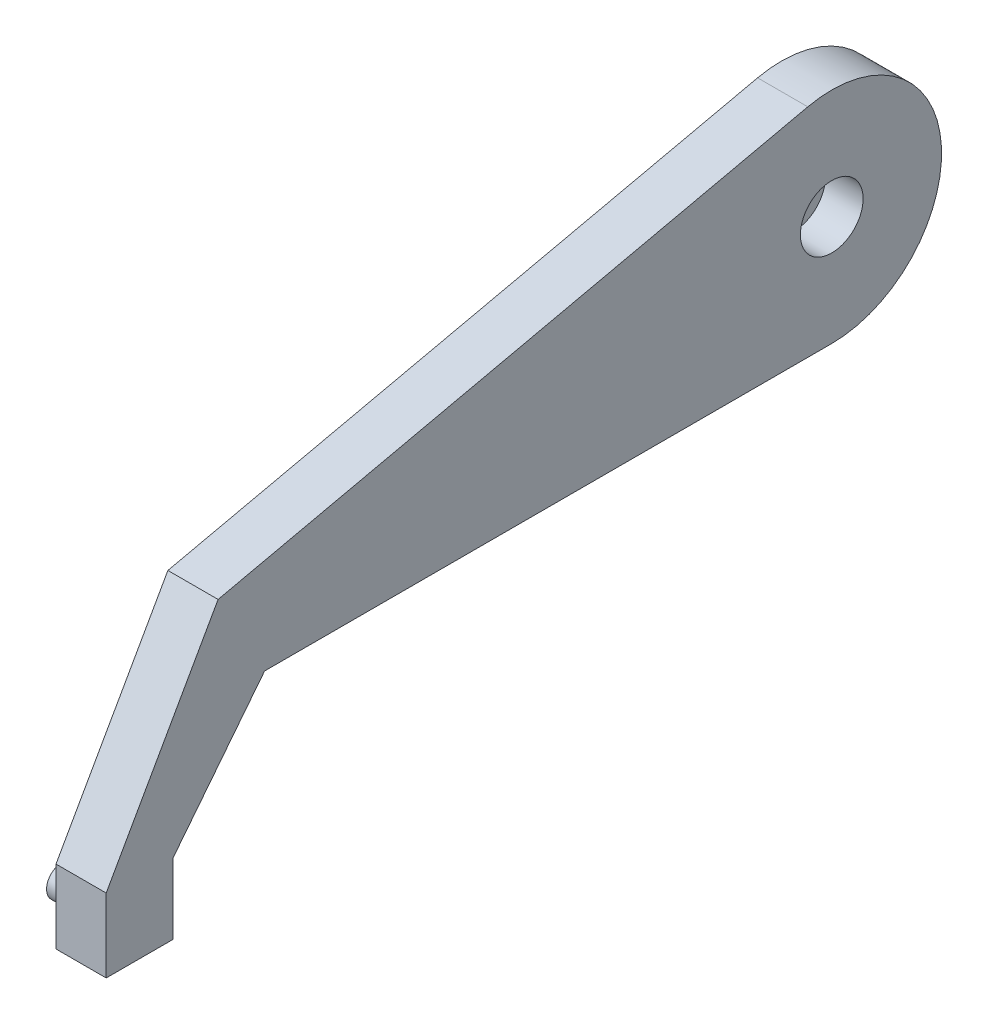
ISO-10303-21;
HEADER;
FILE_DESCRIPTION(('STEP AP214'),'2;1');
FILE_NAME('part.step','',(''),(''),'','','');
FILE_SCHEMA(('AUTOMOTIVE_DESIGN { 1 0 10303 214 1 1 1 1 }'));
ENDSEC;
DATA;
#1=APPLICATION_CONTEXT('core data for automotive mechanical design processes');
#2=APPLICATION_PROTOCOL_DEFINITION('international standard','automotive_design',2000,#1);
#3=PRODUCT_CONTEXT('',#1,'mechanical');
#4=PRODUCT('Part','Part','',(#3));
#5=PRODUCT_RELATED_PRODUCT_CATEGORY('part','',(#4));
#6=PRODUCT_DEFINITION_FORMATION('','',#4);
#7=PRODUCT_DEFINITION_CONTEXT('part definition',#1,'design');
#8=PRODUCT_DEFINITION('design','',#6,#7);
#9=PRODUCT_DEFINITION_SHAPE('','',#8);
#10=(LENGTH_UNIT() NAMED_UNIT(*) SI_UNIT(.MILLI.,.METRE.));
#11=(NAMED_UNIT(*) PLANE_ANGLE_UNIT() SI_UNIT($,.RADIAN.));
#12=(NAMED_UNIT(*) SI_UNIT($,.STERADIAN.) SOLID_ANGLE_UNIT());
#13=UNCERTAINTY_MEASURE_WITH_UNIT(LENGTH_MEASURE(1.E-05),#10,'distance_accuracy_value','');
#14=(GEOMETRIC_REPRESENTATION_CONTEXT(3) GLOBAL_UNCERTAINTY_ASSIGNED_CONTEXT((#13)) GLOBAL_UNIT_ASSIGNED_CONTEXT((#10,
#11,#12)) REPRESENTATION_CONTEXT('',''));
#15=CARTESIAN_POINT('',(0.,0.,0.));
#16=DIRECTION('',(0.,0.,1.));
#17=DIRECTION('',(1.,0.,0.));
#18=AXIS2_PLACEMENT_3D('',#15,#16,#17);
#19=CARTESIAN_POINT('',(80.,294.084726626196,1208.9161975073));
#20=DIRECTION('',(-1.,0.,0.));
#21=DIRECTION('',(0.,0.,1.));
#22=AXIS2_PLACEMENT_3D('',#19,#20,#21);
#23=CYLINDRICAL_SURFACE('',#22,175.);
#24=CARTESIAN_POINT('',(0.,294.084726626196,1208.9161975073));
#25=DIRECTION('',(1.,0.,0.));
#26=DIRECTION('',(0.,0.,1.));
#27=AXIS2_PLACEMENT_3D('',#24,#25,#26);
#28=CIRCLE('',#27,175.);
#29=CARTESIAN_POINT('',(0.,119.084726626196,1208.9161975073));
#30=VERTEX_POINT('',#29);
#31=CARTESIAN_POINT('',(0.,464.873782041208,1247.07505690388));
#32=VERTEX_POINT('',#31);
#33=EDGE_CURVE('E146',#30,#32,#28,.T.);
#34=ORIENTED_EDGE('',*,*,#33,.T.);
#35=DIRECTION('',(-1.,0.,0.));
#36=VECTOR('',#35,1.);
#37=CARTESIAN_POINT('',(80.,464.873782041208,1247.07505690388));
#38=LINE('',#37,#36);
#39=CARTESIAN_POINT('',(80.,464.873782041208,1247.07505690388));
#40=VERTEX_POINT('',#39);
#41=EDGE_CURVE('E11',#40,#32,#38,.T.);
#42=ORIENTED_EDGE('',*,*,#41,.F.);
#43=CARTESIAN_POINT('',(80.,294.084726626196,1208.9161975073));
#44=DIRECTION('',(1.,0.,0.));
#45=DIRECTION('',(0.,0.,1.));
#46=AXIS2_PLACEMENT_3D('',#43,#44,#45);
#47=CIRCLE('',#46,175.);
#48=CARTESIAN_POINT('',(80.,119.084726626196,1208.9161975073));
#49=VERTEX_POINT('',#48);
#50=EDGE_CURVE('E169',#49,#40,#47,.T.);
#51=ORIENTED_EDGE('',*,*,#50,.F.);
#52=DIRECTION('',(-1.,0.,0.));
#53=VECTOR('',#52,1.);
#54=CARTESIAN_POINT('',(80.,119.084726626196,1208.9161975073));
#55=LINE('',#54,#53);
#56=EDGE_CURVE('E142',#49,#30,#55,.T.);
#57=ORIENTED_EDGE('',*,*,#56,.T.);
#58=EDGE_LOOP('',(#34,#42,#51,#57));
#59=FACE_BOUND('',#58,.T.);
#60=ADVANCED_FACE('F45',(#59),#23,.T.);
#61=CARTESIAN_POINT('',(80.,464.873782041208,1247.07505690388));
#62=DIRECTION('',(0.,-0.975937459514354,-0.218050625123315));
#63=DIRECTION('',(0.,0.218050625123315,-0.975937459514354));
#64=AXIS2_PLACEMENT_3D('',#61,#62,#63);
#65=PLANE('',#64);
#66=DIRECTION('',(0.,-0.218050625123315,0.975937459514354));
#67=VECTOR('',#66,1.);
#68=CARTESIAN_POINT('',(0.,464.873782041208,1247.07505690388));
#69=LINE('',#68,#67);
#70=CARTESIAN_POINT('',(0.,254.913114054583,2186.80398818725));
#71=VERTEX_POINT('',#70);
#72=EDGE_CURVE('E150',#32,#71,#69,.T.);
#73=ORIENTED_EDGE('',*,*,#72,.T.);
#74=DIRECTION('',(-1.,0.,0.));
#75=VECTOR('',#74,1.);
#76=CARTESIAN_POINT('',(80.,254.913114054583,2186.80398818725));
#77=LINE('',#76,#75);
#78=CARTESIAN_POINT('',(80.,254.913114054583,2186.80398818725));
#79=VERTEX_POINT('',#78);
#80=EDGE_CURVE('E54',#79,#71,#77,.T.);
#81=ORIENTED_EDGE('',*,*,#80,.F.);
#82=DIRECTION('',(0.,-0.218050625123315,0.975937459514354));
#83=VECTOR('',#82,1.);
#84=CARTESIAN_POINT('',(80.,464.873782041208,1247.07505690388));
#85=LINE('',#84,#83);
#86=EDGE_CURVE('E105',#40,#79,#85,.T.);
#87=ORIENTED_EDGE('',*,*,#86,.F.);
#88=ORIENTED_EDGE('',*,*,#41,.T.);
#89=EDGE_LOOP('',(#73,#81,#87,#88));
#90=FACE_BOUND('',#89,.T.);
#91=ADVANCED_FACE('F253',(#90),#65,.F.);
#92=CARTESIAN_POINT('',(80.,254.913114054583,2186.80398818725));
#93=DIRECTION('',(0.,-0.491359726652531,-0.870956726263682));
#94=DIRECTION('',(0.,0.870956726263682,-0.491359726652531));
#95=AXIS2_PLACEMENT_3D('',#92,#93,#94);
#96=PLANE('',#95);
#97=DIRECTION('',(0.,-0.870956726263682,0.491359726652531));
#98=VECTOR('',#97,1.);
#99=CARTESIAN_POINT('',(0.,254.913114054583,2186.80398818725));
#100=LINE('',#99,#98);
#101=CARTESIAN_POINT('',(0.,-61.1262620595169,2365.10104563698));
#102=VERTEX_POINT('',#101);
#103=EDGE_CURVE('E154',#71,#102,#100,.T.);
#104=ORIENTED_EDGE('',*,*,#103,.T.);
#105=DIRECTION('',(-1.,0.,0.));
#106=VECTOR('',#105,1.);
#107=CARTESIAN_POINT('',(80.,-61.1262620595169,2365.10104563698));
#108=LINE('',#107,#106);
#109=CARTESIAN_POINT('',(80.,-61.1262620595169,2365.10104563698));
#110=VERTEX_POINT('',#109);
#111=EDGE_CURVE('E180',#110,#102,#108,.T.);
#112=ORIENTED_EDGE('',*,*,#111,.F.);
#113=DIRECTION('',(0.,-0.870956726263682,0.491359726652531));
#114=VECTOR('',#113,1.);
#115=CARTESIAN_POINT('',(80.,254.913114054583,2186.80398818725));
#116=LINE('',#115,#114);
#117=EDGE_CURVE('E190',#79,#110,#116,.T.);
#118=ORIENTED_EDGE('',*,*,#117,.F.);
#119=ORIENTED_EDGE('',*,*,#80,.T.);
#120=EDGE_LOOP('',(#104,#112,#118,#119));
#121=FACE_BOUND('',#120,.T.);
#122=ADVANCED_FACE('F188',(#121),#96,.F.);
#123=CARTESIAN_POINT('',(80.,-61.1262620595169,2365.10104563698));
#124=DIRECTION('',(0.,0.,-1.));
#125=DIRECTION('',(-1.,0.,0.));
#126=AXIS2_PLACEMENT_3D('',#123,#124,#125);
#127=PLANE('',#126);
#128=DIRECTION('',(0.,-1.,0.));
#129=VECTOR('',#128,1.);
#130=CARTESIAN_POINT('',(0.,-61.1262620595169,2365.10104563698));
#131=LINE('',#130,#129);
#132=CARTESIAN_POINT('',(0.,-178.375628010269,2365.10104563698));
#133=VERTEX_POINT('',#132);
#134=EDGE_CURVE('E157',#102,#133,#131,.T.);
#135=ORIENTED_EDGE('',*,*,#134,.T.);
#136=DIRECTION('',(-1.,0.,0.));
#137=VECTOR('',#136,1.);
#138=CARTESIAN_POINT('',(80.,-178.375628010269,2365.10104563698));
#139=LINE('',#138,#137);
#140=CARTESIAN_POINT('',(80.,-178.375628010269,2365.10104563698));
#141=VERTEX_POINT('',#140);
#142=EDGE_CURVE('E176',#141,#133,#139,.T.);
#143=ORIENTED_EDGE('',*,*,#142,.F.);
#144=DIRECTION('',(0.,-1.,0.));
#145=VECTOR('',#144,1.);
#146=CARTESIAN_POINT('',(80.,-61.1262620595169,2365.10104563698));
#147=LINE('',#146,#145);
#148=EDGE_CURVE('E203',#110,#141,#147,.T.);
#149=ORIENTED_EDGE('',*,*,#148,.F.);
#150=ORIENTED_EDGE('',*,*,#111,.T.);
#151=EDGE_LOOP('',(#135,#143,#149,#150));
#152=FACE_BOUND('',#151,.T.);
#153=ADVANCED_FACE('F198',(#152),#127,.F.);
#154=CARTESIAN_POINT('',(80.,-178.375628010269,2365.10104563698));
#155=DIRECTION('',(0.,1.,0.));
#156=DIRECTION('',(0.,0.,1.));
#157=AXIS2_PLACEMENT_3D('',#154,#155,#156);
#158=PLANE('',#157);
#159=DIRECTION('',(0.,0.,-1.));
#160=VECTOR('',#159,1.);
#161=CARTESIAN_POINT('',(0.,-178.375628010269,2365.10104563698));
#162=LINE('',#161,#160);
#163=CARTESIAN_POINT('',(0.,-178.375628010269,2258.83533082478));
#164=VERTEX_POINT('',#163);
#165=EDGE_CURVE('E160',#133,#164,#162,.T.);
#166=ORIENTED_EDGE('',*,*,#165,.T.);
#167=DIRECTION('',(-1.,0.,0.));
#168=VECTOR('',#167,1.);
#169=CARTESIAN_POINT('',(80.,-178.375628010269,2258.83533082478));
#170=LINE('',#169,#168);
#171=CARTESIAN_POINT('',(80.,-178.375628010269,2258.83533082478));
#172=VERTEX_POINT('',#171);
#173=EDGE_CURVE('E135',#172,#164,#170,.T.);
#174=ORIENTED_EDGE('',*,*,#173,.F.);
#175=DIRECTION('',(0.,0.,-1.));
#176=VECTOR('',#175,1.);
#177=CARTESIAN_POINT('',(80.,-178.375628010269,2365.10104563698));
#178=LINE('',#177,#176);
#179=EDGE_CURVE('E124',#141,#172,#178,.T.);
#180=ORIENTED_EDGE('',*,*,#179,.F.);
#181=ORIENTED_EDGE('',*,*,#142,.T.);
#182=EDGE_LOOP('',(#166,#174,#180,#181));
#183=FACE_BOUND('',#182,.T.);
#184=ADVANCED_FACE('F201',(#183),#158,.F.);
#185=CARTESIAN_POINT('',(80.,-178.375628010269,2258.83533082478));
#186=DIRECTION('',(0.,0.,1.));
#187=DIRECTION('',(1.,0.,0.));
#188=AXIS2_PLACEMENT_3D('',#185,#186,#187);
#189=PLANE('',#188);
#190=DIRECTION('',(0.,1.,0.));
#191=VECTOR('',#190,1.);
#192=CARTESIAN_POINT('',(0.,-178.375628010269,2258.83533082478));
#193=LINE('',#192,#191);
#194=CARTESIAN_POINT('',(0.,-66.2761832366053,2258.83533082478));
#195=VERTEX_POINT('',#194);
#196=EDGE_CURVE('E133',#164,#195,#193,.T.);
#197=ORIENTED_EDGE('',*,*,#196,.T.);
#198=DIRECTION('',(-1.,0.,0.));
#199=VECTOR('',#198,1.);
#200=CARTESIAN_POINT('',(80.,-66.2761832366053,2258.83533082478));
#201=LINE('',#200,#199);
#202=CARTESIAN_POINT('',(80.,-66.2761832366053,2258.83533082478));
#203=VERTEX_POINT('',#202);
#204=EDGE_CURVE('E130',#203,#195,#201,.T.);
#205=ORIENTED_EDGE('',*,*,#204,.F.);
#206=DIRECTION('',(0.,1.,0.));
#207=VECTOR('',#206,1.);
#208=CARTESIAN_POINT('',(80.,-178.375628010269,2258.83533082478));
#209=LINE('',#208,#207);
#210=EDGE_CURVE('E118',#172,#203,#209,.T.);
#211=ORIENTED_EDGE('',*,*,#210,.F.);
#212=ORIENTED_EDGE('',*,*,#173,.T.);
#213=EDGE_LOOP('',(#197,#205,#211,#212));
#214=FACE_BOUND('',#213,.T.);
#215=ADVANCED_FACE('F131',(#214),#189,.F.);
#216=CARTESIAN_POINT('',(80.,-66.2761832366053,2258.83533082478));
#217=DIRECTION('',(0.,0.619086939164466,0.785322457183018));
#218=DIRECTION('',(0.,-0.785322457183018,0.619086939164466));
#219=AXIS2_PLACEMENT_3D('',#216,#217,#218);
#220=PLANE('',#219);
#221=DIRECTION('',(0.,0.785322457183018,-0.619086939164466));
#222=VECTOR('',#221,1.);
#223=CARTESIAN_POINT('',(0.,-66.2761832366053,2258.83533082478));
#224=LINE('',#223,#222);
#225=CARTESIAN_POINT('',(0.,119.084726626196,2112.71125493966));
#226=VERTEX_POINT('',#225);
#227=EDGE_CURVE('E91',#195,#226,#224,.T.);
#228=ORIENTED_EDGE('',*,*,#227,.T.);
#229=DIRECTION('',(-1.,0.,0.));
#230=VECTOR('',#229,1.);
#231=CARTESIAN_POINT('',(80.,119.084726626196,2112.71125493966));
#232=LINE('',#231,#230);
#233=CARTESIAN_POINT('',(80.,119.084726626196,2112.71125493966));
#234=VERTEX_POINT('',#233);
#235=EDGE_CURVE('E136',#234,#226,#232,.T.);
#236=ORIENTED_EDGE('',*,*,#235,.F.);
#237=DIRECTION('',(0.,0.785322457183018,-0.619086939164466));
#238=VECTOR('',#237,1.);
#239=CARTESIAN_POINT('',(80.,-66.2761832366053,2258.83533082478));
#240=LINE('',#239,#238);
#241=EDGE_CURVE('E122',#203,#234,#240,.T.);
#242=ORIENTED_EDGE('',*,*,#241,.F.);
#243=ORIENTED_EDGE('',*,*,#204,.T.);
#244=EDGE_LOOP('',(#228,#236,#242,#243));
#245=FACE_BOUND('',#244,.T.);
#246=ADVANCED_FACE('F138',(#245),#220,.F.);
#247=CARTESIAN_POINT('',(80.,119.084726626196,2112.71125493966));
#248=DIRECTION('',(0.,1.,0.));
#249=DIRECTION('',(0.,0.,1.));
#250=AXIS2_PLACEMENT_3D('',#247,#248,#249);
#251=PLANE('',#250);
#252=DIRECTION('',(0.,0.,-1.));
#253=VECTOR('',#252,1.);
#254=CARTESIAN_POINT('',(0.,119.084726626196,2112.71125493966));
#255=LINE('',#254,#253);
#256=EDGE_CURVE('E97',#226,#30,#255,.T.);
#257=ORIENTED_EDGE('',*,*,#256,.T.);
#258=ORIENTED_EDGE('',*,*,#56,.F.);
#259=DIRECTION('',(0.,0.,-1.));
#260=VECTOR('',#259,1.);
#261=CARTESIAN_POINT('',(80.,119.084726626196,2112.71125493966));
#262=LINE('',#261,#260);
#263=EDGE_CURVE('E62',#234,#49,#262,.T.);
#264=ORIENTED_EDGE('',*,*,#263,.F.);
#265=ORIENTED_EDGE('',*,*,#235,.T.);
#266=EDGE_LOOP('',(#257,#258,#264,#265));
#267=FACE_BOUND('',#266,.T.);
#268=ADVANCED_FACE('F248',(#267),#251,.F.);
#269=CARTESIAN_POINT('',(80.,294.084726626196,1208.9161975073));
#270=DIRECTION('',(-1.,0.,0.));
#271=DIRECTION('',(0.,0.,1.));
#272=AXIS2_PLACEMENT_3D('',#269,#270,#271);
#273=PLANE('',#272);
#274=CARTESIAN_POINT('',(80.,294.084726626196,1208.9161975073));
#275=DIRECTION('',(1.,0.,0.));
#276=DIRECTION('',(0.,0.,-1.));
#277=AXIS2_PLACEMENT_3D('',#274,#275,#276);
#278=CIRCLE('',#277,50.);
#279=CARTESIAN_POINT('',(80.,294.084726626196,1158.9161975073));
#280=VERTEX_POINT('',#279);
#281=EDGE_CURVE('E213',#280,#280,#278,.T.);
#282=ORIENTED_EDGE('',*,*,#281,.F.);
#283=EDGE_LOOP('',(#282));
#284=FACE_BOUND('',#283,.T.);
#285=ORIENTED_EDGE('',*,*,#50,.T.);
#286=ORIENTED_EDGE('',*,*,#86,.T.);
#287=ORIENTED_EDGE('',*,*,#117,.T.);
#288=ORIENTED_EDGE('',*,*,#148,.T.);
#289=ORIENTED_EDGE('',*,*,#179,.T.);
#290=ORIENTED_EDGE('',*,*,#210,.T.);
#291=ORIENTED_EDGE('',*,*,#241,.T.);
#292=ORIENTED_EDGE('',*,*,#263,.T.);
#293=EDGE_LOOP('',(#285,#286,#287,#288,#289,#290,#291,#292));
#294=FACE_BOUND('',#293,.T.);
#295=ADVANCED_FACE('F120',(#284,#294),#273,.F.);
#296=CARTESIAN_POINT('',(0.,294.084726626196,1208.9161975073));
#297=DIRECTION('',(-1.,0.,0.));
#298=DIRECTION('',(0.,0.,1.));
#299=AXIS2_PLACEMENT_3D('',#296,#297,#298);
#300=PLANE('',#299);
#301=CARTESIAN_POINT('',(0.,-138.375628010269,2305.10104563698));
#302=DIRECTION('',(-1.,0.,0.));
#303=DIRECTION('',(0.,0.,1.));
#304=AXIS2_PLACEMENT_3D('',#301,#302,#303);
#305=CIRCLE('',#304,25.);
#306=CARTESIAN_POINT('',(0.,-138.375628010269,2330.10104563698));
#307=VERTEX_POINT('',#306);
#308=EDGE_CURVE('E221',#307,#307,#305,.T.);
#309=ORIENTED_EDGE('',*,*,#308,.F.);
#310=EDGE_LOOP('',(#309));
#311=FACE_BOUND('',#310,.T.);
#312=ORIENTED_EDGE('',*,*,#33,.F.);
#313=ORIENTED_EDGE('',*,*,#256,.F.);
#314=ORIENTED_EDGE('',*,*,#227,.F.);
#315=ORIENTED_EDGE('',*,*,#196,.F.);
#316=ORIENTED_EDGE('',*,*,#165,.F.);
#317=ORIENTED_EDGE('',*,*,#134,.F.);
#318=ORIENTED_EDGE('',*,*,#103,.F.);
#319=ORIENTED_EDGE('',*,*,#72,.F.);
#320=EDGE_LOOP('',(#312,#313,#314,#315,#316,#317,#318,#319));
#321=FACE_BOUND('',#320,.T.);
#322=ADVANCED_FACE('F194',(#311,#321),#300,.T.);
#323=CARTESIAN_POINT('',(20.,294.084726626196,1208.9161975073));
#324=DIRECTION('',(1.,0.,0.));
#325=DIRECTION('',(0.,0.,-1.));
#326=AXIS2_PLACEMENT_3D('',#323,#324,#325);
#327=CYLINDRICAL_SURFACE('',#326,50.);
#328=CARTESIAN_POINT('',(20.,294.084726626196,1208.9161975073));
#329=DIRECTION('',(1.,0.,0.));
#330=DIRECTION('',(0.,0.,-1.));
#331=AXIS2_PLACEMENT_3D('',#328,#329,#330);
#332=CIRCLE('',#331,50.);
#333=CARTESIAN_POINT('',(20.,294.084726626196,1158.9161975073));
#334=VERTEX_POINT('',#333);
#335=EDGE_CURVE('E151',#334,#334,#332,.T.);
#336=CARTESIAN_POINT('',(20.,294.084726626196,1158.9161975073));
#337=CARTESIAN_POINT('',(20.625,294.084726626196,1158.9161975073));
#338=CARTESIAN_POINT('',(21.25,294.084726626196,1158.9161975073));
#339=CARTESIAN_POINT('',(22.5,294.084726626196,1158.9161975073));
#340=CARTESIAN_POINT('',(23.125,294.084726626196,1158.9161975073));
#341=CARTESIAN_POINT('',(24.375,294.084726626196,1158.9161975073));
#342=CARTESIAN_POINT('',(25.,294.084726626196,1158.9161975073));
#343=CARTESIAN_POINT('',(26.25,294.084726626196,1158.9161975073));
#344=CARTESIAN_POINT('',(26.875,294.084726626196,1158.9161975073));
#345=CARTESIAN_POINT('',(28.125,294.084726626196,1158.9161975073));
#346=CARTESIAN_POINT('',(28.75,294.084726626196,1158.9161975073));
#347=CARTESIAN_POINT('',(30.,294.084726626196,1158.9161975073));
#348=CARTESIAN_POINT('',(30.625,294.084726626196,1158.9161975073));
#349=CARTESIAN_POINT('',(31.875,294.084726626196,1158.9161975073));
#350=CARTESIAN_POINT('',(32.5,294.084726626196,1158.9161975073));
#351=CARTESIAN_POINT('',(33.75,294.084726626196,1158.9161975073));
#352=CARTESIAN_POINT('',(34.375,294.084726626196,1158.9161975073));
#353=CARTESIAN_POINT('',(35.625,294.084726626196,1158.9161975073));
#354=CARTESIAN_POINT('',(36.25,294.084726626196,1158.9161975073));
#355=CARTESIAN_POINT('',(37.5,294.084726626196,1158.9161975073));
#356=CARTESIAN_POINT('',(38.125,294.084726626196,1158.9161975073));
#357=CARTESIAN_POINT('',(39.375,294.084726626196,1158.9161975073));
#358=CARTESIAN_POINT('',(40.,294.084726626196,1158.9161975073));
#359=CARTESIAN_POINT('',(41.25,294.084726626196,1158.9161975073));
#360=CARTESIAN_POINT('',(41.875,294.084726626196,1158.9161975073));
#361=CARTESIAN_POINT('',(43.125,294.084726626196,1158.9161975073));
#362=CARTESIAN_POINT('',(43.75,294.084726626196,1158.9161975073));
#363=CARTESIAN_POINT('',(45.,294.084726626196,1158.9161975073));
#364=CARTESIAN_POINT('',(45.625,294.084726626196,1158.9161975073));
#365=CARTESIAN_POINT('',(46.875,294.084726626196,1158.9161975073));
#366=CARTESIAN_POINT('',(47.5,294.084726626196,1158.9161975073));
#367=CARTESIAN_POINT('',(48.75,294.084726626196,1158.9161975073));
#368=CARTESIAN_POINT('',(49.375,294.084726626196,1158.9161975073));
#369=CARTESIAN_POINT('',(50.625,294.084726626196,1158.9161975073));
#370=CARTESIAN_POINT('',(51.25,294.084726626196,1158.9161975073));
#371=CARTESIAN_POINT('',(52.5,294.084726626196,1158.9161975073));
#372=CARTESIAN_POINT('',(53.125,294.084726626196,1158.9161975073));
#373=CARTESIAN_POINT('',(54.375,294.084726626196,1158.9161975073));
#374=CARTESIAN_POINT('',(55.,294.084726626196,1158.9161975073));
#375=CARTESIAN_POINT('',(56.25,294.084726626196,1158.9161975073));
#376=CARTESIAN_POINT('',(56.875,294.084726626196,1158.9161975073));
#377=CARTESIAN_POINT('',(58.125,294.084726626196,1158.9161975073));
#378=CARTESIAN_POINT('',(58.75,294.084726626196,1158.9161975073));
#379=CARTESIAN_POINT('',(60.,294.084726626196,1158.9161975073));
#380=CARTESIAN_POINT('',(60.625,294.084726626196,1158.9161975073));
#381=CARTESIAN_POINT('',(61.875,294.084726626196,1158.9161975073));
#382=CARTESIAN_POINT('',(62.5,294.084726626196,1158.9161975073));
#383=CARTESIAN_POINT('',(63.75,294.084726626196,1158.9161975073));
#384=CARTESIAN_POINT('',(64.375,294.084726626196,1158.9161975073));
#385=CARTESIAN_POINT('',(65.625,294.084726626196,1158.9161975073));
#386=CARTESIAN_POINT('',(66.25,294.084726626196,1158.9161975073));
#387=CARTESIAN_POINT('',(67.5,294.084726626196,1158.9161975073));
#388=CARTESIAN_POINT('',(68.125,294.084726626196,1158.9161975073));
#389=CARTESIAN_POINT('',(69.375,294.084726626196,1158.9161975073));
#390=CARTESIAN_POINT('',(70.,294.084726626196,1158.9161975073));
#391=CARTESIAN_POINT('',(71.25,294.084726626196,1158.9161975073));
#392=CARTESIAN_POINT('',(71.875,294.084726626196,1158.9161975073));
#393=CARTESIAN_POINT('',(73.125,294.084726626196,1158.9161975073));
#394=CARTESIAN_POINT('',(73.75,294.084726626196,1158.9161975073));
#395=CARTESIAN_POINT('',(75.,294.084726626196,1158.9161975073));
#396=CARTESIAN_POINT('',(75.625,294.084726626196,1158.9161975073));
#397=CARTESIAN_POINT('',(76.875,294.084726626196,1158.9161975073));
#398=CARTESIAN_POINT('',(77.5,294.084726626196,1158.9161975073));
#399=CARTESIAN_POINT('',(78.75,294.084726626196,1158.9161975073));
#400=CARTESIAN_POINT('',(79.375,294.084726626196,1158.9161975073));
#401=CARTESIAN_POINT('',(80.,294.084726626196,1158.9161975073));
#402=B_SPLINE_CURVE_WITH_KNOTS('',3,(#336,#337,#338,#339,#340,#341,#342,#343,#344,#345,#346,
#347,#348,#349,#350,#351,#352,#353,#354,#355,#356,#357,#358,#359,#360,#361,#362,#363,#364,#365,
#366,#367,#368,#369,#370,#371,#372,#373,#374,#375,#376,#377,#378,#379,#380,#381,#382,#383,#384,
#385,#386,#387,#388,#389,#390,#391,#392,#393,#394,#395,#396,#397,#398,#399,#400,#401),
.UNSPECIFIED.,.F.,.F.,(4,2,2,2,2,2,2,2,2,2,2,2,2,2,2,2,2,2,2,2,2,2,2,2,2,2,2,2,2,2,2,2,4),(0.,
1.875,3.75,5.625,7.5,9.375,11.25,13.125,15.,16.875,18.75,20.625,22.5,24.375,26.25,28.125,30.,
31.875,33.75,35.625,37.5,39.375,41.25,43.125,45.,46.875,48.75,50.625,52.5,54.375,56.25,58.125,
60.),.UNSPECIFIED.);
#403=EDGE_CURVE('BSEAM239',#334,#280,#402,.T.);
#404=ORIENTED_EDGE('',*,*,#335,.F.);
#405=ORIENTED_EDGE('',*,*,#281,.T.);
#406=ORIENTED_EDGE('',*,*,#403,.T.);
#407=ORIENTED_EDGE('',*,*,#403,.F.);
#408=EDGE_LOOP('',(#404,#406,#405,#407));
#409=FACE_BOUND('',#408,.T.);
#410=ADVANCED_FACE('F239',(#409),#327,.F.);
#411=CARTESIAN_POINT('',(20.,294.084726626196,1208.9161975073));
#412=DIRECTION('',(1.,0.,0.));
#413=DIRECTION('',(0.,0.,-1.));
#414=AXIS2_PLACEMENT_3D('',#411,#412,#413);
#415=PLANE('',#414);
#416=ORIENTED_EDGE('',*,*,#335,.T.);
#417=EDGE_LOOP('',(#416));
#418=FACE_BOUND('',#417,.T.);
#419=ADVANCED_FACE('F234',(#418),#415,.T.);
#420=CARTESIAN_POINT('',(-50.,-138.375628010269,2305.10104563698));
#421=DIRECTION('',(1.,0.,0.));
#422=DIRECTION('',(0.,0.,-1.));
#423=AXIS2_PLACEMENT_3D('',#420,#421,#422);
#424=CYLINDRICAL_SURFACE('',#423,25.);
#425=CARTESIAN_POINT('',(-50.,-138.375628010269,2305.10104563698));
#426=DIRECTION('',(-1.,0.,0.));
#427=DIRECTION('',(0.,0.,1.));
#428=AXIS2_PLACEMENT_3D('',#425,#426,#427);
#429=CIRCLE('',#428,25.);
#430=CARTESIAN_POINT('',(-50.,-138.375628010269,2330.10104563698));
#431=VERTEX_POINT('',#430);
#432=EDGE_CURVE('E217',#431,#431,#429,.T.);
#433=ORIENTED_EDGE('',*,*,#432,.F.);
#434=EDGE_LOOP('',(#433));
#435=FACE_BOUND('',#434,.T.);
#436=ORIENTED_EDGE('',*,*,#308,.T.);
#437=EDGE_LOOP('',(#436));
#438=FACE_BOUND('',#437,.T.);
#439=ADVANCED_FACE('F231',(#435,#438),#424,.T.);
#440=CARTESIAN_POINT('',(-50.,-138.375628010269,2305.10104563698));
#441=DIRECTION('',(-1.,0.,0.));
#442=DIRECTION('',(0.,0.,1.));
#443=AXIS2_PLACEMENT_3D('',#440,#441,#442);
#444=PLANE('',#443);
#445=ORIENTED_EDGE('',*,*,#432,.T.);
#446=EDGE_LOOP('',(#445));
#447=FACE_BOUND('',#446,.T.);
#448=ADVANCED_FACE('F229',(#447),#444,.T.);
#449=CLOSED_SHELL('',(#60,#91,#122,#153,#184,#215,#246,#268,#295,#322,#410,#419,#439,#448));
#450=MANIFOLD_SOLID_BREP('B2',#449);
#451=ADVANCED_BREP_SHAPE_REPRESENTATION('',(#18,#450),#14);
#452=SHAPE_DEFINITION_REPRESENTATION(#9,#451);
ENDSEC;
END-ISO-10303-21;
